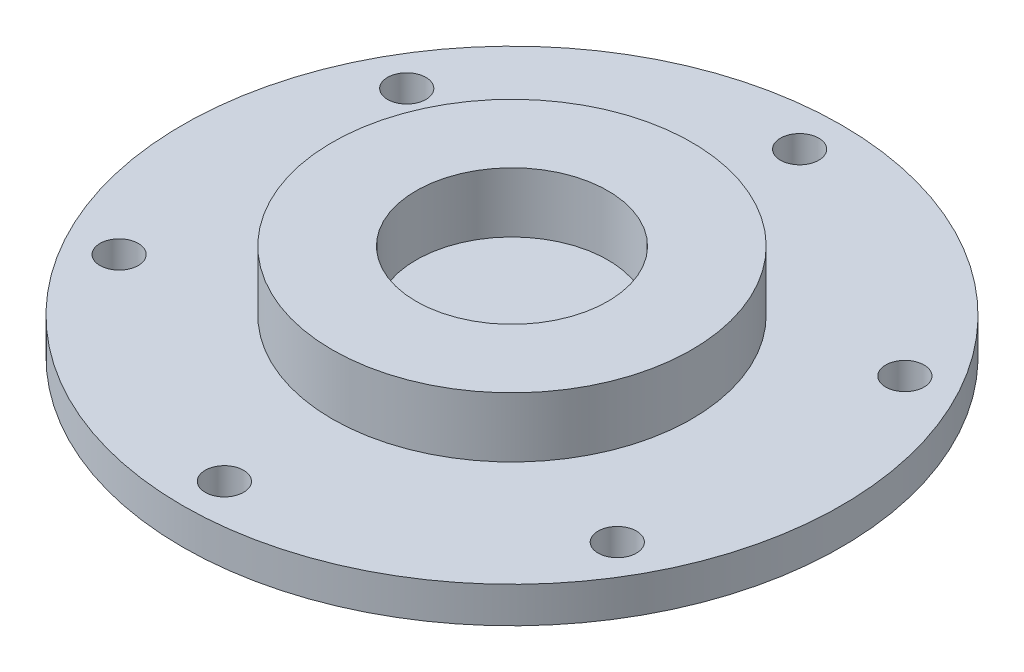
ISO-10303-21;
HEADER;
FILE_DESCRIPTION(('STEP AP214'),'2;1');
FILE_NAME('part.step','',(''),(''),'','','');
FILE_SCHEMA(('AUTOMOTIVE_DESIGN { 1 0 10303 214 1 1 1 1 }'));
ENDSEC;
DATA;
#1=APPLICATION_CONTEXT('core data for automotive mechanical design processes');
#2=APPLICATION_PROTOCOL_DEFINITION('international standard','automotive_design',2000,#1);
#3=PRODUCT_CONTEXT('',#1,'mechanical');
#4=PRODUCT('Part','Part','',(#3));
#5=PRODUCT_RELATED_PRODUCT_CATEGORY('part','',(#4));
#6=PRODUCT_DEFINITION_FORMATION('','',#4);
#7=PRODUCT_DEFINITION_CONTEXT('part definition',#1,'design');
#8=PRODUCT_DEFINITION('design','',#6,#7);
#9=PRODUCT_DEFINITION_SHAPE('','',#8);
#10=(LENGTH_UNIT() NAMED_UNIT(*) SI_UNIT(.MILLI.,.METRE.));
#11=(NAMED_UNIT(*) PLANE_ANGLE_UNIT() SI_UNIT($,.RADIAN.));
#12=(NAMED_UNIT(*) SI_UNIT($,.STERADIAN.) SOLID_ANGLE_UNIT());
#13=UNCERTAINTY_MEASURE_WITH_UNIT(LENGTH_MEASURE(1.E-05),#10,'distance_accuracy_value','');
#14=(GEOMETRIC_REPRESENTATION_CONTEXT(3) GLOBAL_UNCERTAINTY_ASSIGNED_CONTEXT((#13)) GLOBAL_UNIT_ASSIGNED_CONTEXT((#10,
#11,#12)) REPRESENTATION_CONTEXT('',''));
#15=CARTESIAN_POINT('',(0.,0.,0.));
#16=DIRECTION('',(0.,0.,1.));
#17=DIRECTION('',(1.,0.,0.));
#18=AXIS2_PLACEMENT_3D('',#15,#16,#17);
#19=CARTESIAN_POINT('',(0.,3.,0.));
#20=DIRECTION('',(0.,-1.,0.));
#21=DIRECTION('',(0.,0.,-1.));
#22=AXIS2_PLACEMENT_3D('',#19,#20,#21);
#23=CYLINDRICAL_SURFACE('',#22,27.5);
#24=CARTESIAN_POINT('',(0.,3.,0.));
#25=DIRECTION('',(0.,1.,0.));
#26=DIRECTION('',(0.,0.,1.));
#27=AXIS2_PLACEMENT_3D('',#24,#25,#26);
#28=CIRCLE('',#27,27.5);
#29=CARTESIAN_POINT('',(0.,3.,27.5));
#30=VERTEX_POINT('',#29);
#31=EDGE_CURVE('E10',#30,#30,#28,.T.);
#32=ORIENTED_EDGE('',*,*,#31,.F.);
#33=EDGE_LOOP('',(#32));
#34=FACE_BOUND('',#33,.T.);
#35=CARTESIAN_POINT('',(0.,0.,0.));
#36=DIRECTION('',(0.,1.,0.));
#37=DIRECTION('',(0.,0.,1.));
#38=AXIS2_PLACEMENT_3D('',#35,#36,#37);
#39=CIRCLE('',#38,27.5);
#40=CARTESIAN_POINT('',(0.,0.,27.5));
#41=VERTEX_POINT('',#40);
#42=EDGE_CURVE('E37',#41,#41,#39,.T.);
#43=ORIENTED_EDGE('',*,*,#42,.T.);
#44=EDGE_LOOP('',(#43));
#45=FACE_BOUND('',#44,.T.);
#46=ADVANCED_FACE('F34',(#34,#45),#23,.T.);
#47=CARTESIAN_POINT('',(0.,3.,0.));
#48=DIRECTION('',(0.,1.,0.));
#49=DIRECTION('',(0.,0.,1.));
#50=AXIS2_PLACEMENT_3D('',#47,#48,#49);
#51=PLANE('',#50);
#52=CARTESIAN_POINT('',(-20.7846096908265,3.,12.0000000000001));
#53=DIRECTION('',(0.,1.,0.));
#54=DIRECTION('',(0.866025403784436,0.,-0.500000000000004));
#55=AXIS2_PLACEMENT_3D('',#52,#53,#54);
#56=CIRCLE('',#55,1.6);
#57=CARTESIAN_POINT('',(-20.7846096908265,3.,13.6000000000001));
#58=VERTEX_POINT('',#57);
#59=EDGE_CURVE('E81',#58,#58,#56,.T.);
#60=ORIENTED_EDGE('',*,*,#59,.F.);
#61=EDGE_LOOP('',(#60));
#62=FACE_BOUND('',#61,.T.);
#63=CARTESIAN_POINT('',(0.,3.,24.));
#64=DIRECTION('',(0.,1.,0.));
#65=DIRECTION('',(0.,0.,-1.));
#66=AXIS2_PLACEMENT_3D('',#63,#64,#65);
#67=CIRCLE('',#66,1.6);
#68=CARTESIAN_POINT('',(0.,3.,25.6));
#69=VERTEX_POINT('',#68);
#70=EDGE_CURVE('E75',#69,#69,#67,.T.);
#71=ORIENTED_EDGE('',*,*,#70,.F.);
#72=EDGE_LOOP('',(#71));
#73=FACE_BOUND('',#72,.T.);
#74=CARTESIAN_POINT('',(20.7846096908266,3.,11.9999999999998));
#75=DIRECTION('',(0.,1.,0.));
#76=DIRECTION('',(-0.866025403784443,0.,-0.499999999999992));
#77=AXIS2_PLACEMENT_3D('',#74,#75,#76);
#78=CIRCLE('',#77,1.6);
#79=CARTESIAN_POINT('',(20.7846096908266,3.,13.5999999999998));
#80=VERTEX_POINT('',#79);
#81=EDGE_CURVE('E67',#80,#80,#78,.T.);
#82=ORIENTED_EDGE('',*,*,#81,.F.);
#83=EDGE_LOOP('',(#82));
#84=FACE_BOUND('',#83,.T.);
#85=CARTESIAN_POINT('',(20.7846096908264,3.,-12.0000000000002));
#86=DIRECTION('',(0.,1.,0.));
#87=DIRECTION('',(-0.866025403784433,0.,0.50000000000001));
#88=AXIS2_PLACEMENT_3D('',#85,#86,#87);
#89=CIRCLE('',#88,1.6);
#90=CARTESIAN_POINT('',(20.7846096908264,3.,-10.4000000000002));
#91=VERTEX_POINT('',#90);
#92=EDGE_CURVE('E68',#91,#91,#89,.T.);
#93=ORIENTED_EDGE('',*,*,#92,.F.);
#94=EDGE_LOOP('',(#93));
#95=FACE_BOUND('',#94,.T.);
#96=CARTESIAN_POINT('',(-20.7846096908266,3.,-12.));
#97=DIRECTION('',(0.,1.,0.));
#98=DIRECTION('',(0.86602540378444,0.,0.499999999999998));
#99=AXIS2_PLACEMENT_3D('',#96,#97,#98);
#100=CIRCLE('',#99,1.6);
#101=CARTESIAN_POINT('',(-20.7846096908266,3.,-10.4));
#102=VERTEX_POINT('',#101);
#103=EDGE_CURVE('E60',#102,#102,#100,.T.);
#104=ORIENTED_EDGE('',*,*,#103,.F.);
#105=EDGE_LOOP('',(#104));
#106=FACE_BOUND('',#105,.T.);
#107=CARTESIAN_POINT('',(0.,3.,-24.));
#108=DIRECTION('',(0.,1.,0.));
#109=DIRECTION('',(0.,0.,1.));
#110=AXIS2_PLACEMENT_3D('',#107,#108,#109);
#111=CIRCLE('',#110,1.6);
#112=CARTESIAN_POINT('',(0.,3.,-22.4));
#113=VERTEX_POINT('',#112);
#114=EDGE_CURVE('E54',#113,#113,#111,.T.);
#115=ORIENTED_EDGE('',*,*,#114,.F.);
#116=EDGE_LOOP('',(#115));
#117=FACE_BOUND('',#116,.T.);
#118=CARTESIAN_POINT('',(0.,3.,0.));
#119=DIRECTION('',(0.,1.,0.));
#120=DIRECTION('',(0.,0.,1.));
#121=AXIS2_PLACEMENT_3D('',#118,#119,#120);
#122=CIRCLE('',#121,15.);
#123=CARTESIAN_POINT('',(0.,3.,15.));
#124=VERTEX_POINT('',#123);
#125=EDGE_CURVE('E46',#124,#124,#122,.T.);
#126=ORIENTED_EDGE('',*,*,#125,.F.);
#127=EDGE_LOOP('',(#126));
#128=FACE_BOUND('',#127,.T.);
#129=ORIENTED_EDGE('',*,*,#31,.T.);
#130=EDGE_LOOP('',(#129));
#131=FACE_BOUND('',#130,.T.);
#132=ADVANCED_FACE('F117',(#62,#73,#84,#95,#106,#117,#128,#131),#51,.T.);
#133=CARTESIAN_POINT('',(0.,0.,0.));
#134=DIRECTION('',(0.,1.,0.));
#135=DIRECTION('',(0.,0.,1.));
#136=AXIS2_PLACEMENT_3D('',#133,#134,#135);
#137=PLANE('',#136);
#138=CARTESIAN_POINT('',(-20.7846096908265,0.,12.0000000000001));
#139=DIRECTION('',(0.,1.,0.));
#140=DIRECTION('',(0.,0.,1.));
#141=AXIS2_PLACEMENT_3D('',#138,#139,#140);
#142=CIRCLE('',#141,1.6);
#143=CARTESIAN_POINT('',(-20.7846096908265,0.,13.6000000000001));
#144=VERTEX_POINT('',#143);
#145=EDGE_CURVE('E63',#144,#144,#142,.F.);
#146=ORIENTED_EDGE('',*,*,#145,.F.);
#147=EDGE_LOOP('',(#146));
#148=FACE_BOUND('',#147,.T.);
#149=CARTESIAN_POINT('',(0.,0.,24.));
#150=DIRECTION('',(0.,1.,0.));
#151=DIRECTION('',(0.,0.,1.));
#152=AXIS2_PLACEMENT_3D('',#149,#150,#151);
#153=CIRCLE('',#152,1.6);
#154=CARTESIAN_POINT('',(0.,0.,25.6));
#155=VERTEX_POINT('',#154);
#156=EDGE_CURVE('E78',#155,#155,#153,.F.);
#157=ORIENTED_EDGE('',*,*,#156,.F.);
#158=EDGE_LOOP('',(#157));
#159=FACE_BOUND('',#158,.T.);
#160=CARTESIAN_POINT('',(20.7846096908266,0.,11.9999999999998));
#161=DIRECTION('',(0.,1.,0.));
#162=DIRECTION('',(0.,0.,1.));
#163=AXIS2_PLACEMENT_3D('',#160,#161,#162);
#164=CIRCLE('',#163,1.6);
#165=CARTESIAN_POINT('',(20.7846096908266,0.,13.5999999999998));
#166=VERTEX_POINT('',#165);
#167=EDGE_CURVE('E72',#166,#166,#164,.F.);
#168=ORIENTED_EDGE('',*,*,#167,.F.);
#169=EDGE_LOOP('',(#168));
#170=FACE_BOUND('',#169,.T.);
#171=CARTESIAN_POINT('',(20.7846096908264,0.,-12.0000000000002));
#172=DIRECTION('',(0.,1.,0.));
#173=DIRECTION('',(0.,0.,1.));
#174=AXIS2_PLACEMENT_3D('',#171,#172,#173);
#175=CIRCLE('',#174,1.6);
#176=CARTESIAN_POINT('',(20.7846096908264,0.,-10.4000000000002));
#177=VERTEX_POINT('',#176);
#178=EDGE_CURVE('E64',#177,#177,#175,.F.);
#179=ORIENTED_EDGE('',*,*,#178,.F.);
#180=EDGE_LOOP('',(#179));
#181=FACE_BOUND('',#180,.T.);
#182=CARTESIAN_POINT('',(-20.7846096908266,0.,-12.));
#183=DIRECTION('',(0.,1.,0.));
#184=DIRECTION('',(0.,0.,1.));
#185=AXIS2_PLACEMENT_3D('',#182,#183,#184);
#186=CIRCLE('',#185,1.6);
#187=CARTESIAN_POINT('',(-20.7846096908266,0.,-10.4));
#188=VERTEX_POINT('',#187);
#189=EDGE_CURVE('E57',#188,#188,#186,.F.);
#190=ORIENTED_EDGE('',*,*,#189,.F.);
#191=EDGE_LOOP('',(#190));
#192=FACE_BOUND('',#191,.T.);
#193=CARTESIAN_POINT('',(0.,0.,-24.));
#194=DIRECTION('',(0.,1.,0.));
#195=DIRECTION('',(0.,0.,1.));
#196=AXIS2_PLACEMENT_3D('',#193,#194,#195);
#197=CIRCLE('',#196,1.6);
#198=CARTESIAN_POINT('',(0.,0.,-22.4));
#199=VERTEX_POINT('',#198);
#200=EDGE_CURVE('E49',#199,#199,#197,.F.);
#201=ORIENTED_EDGE('',*,*,#200,.F.);
#202=EDGE_LOOP('',(#201));
#203=FACE_BOUND('',#202,.T.);
#204=ORIENTED_EDGE('',*,*,#42,.F.);
#205=EDGE_LOOP('',(#204));
#206=FACE_BOUND('',#205,.T.);
#207=ADVANCED_FACE('F113',(#148,#159,#170,#181,#192,#203,#206),#137,.F.);
#208=CARTESIAN_POINT('',(0.,8.,0.));
#209=DIRECTION('',(0.,-1.,0.));
#210=DIRECTION('',(0.,0.,-1.));
#211=AXIS2_PLACEMENT_3D('',#208,#209,#210);
#212=CYLINDRICAL_SURFACE('',#211,15.);
#213=CARTESIAN_POINT('',(0.,8.,0.));
#214=DIRECTION('',(0.,1.,0.));
#215=DIRECTION('',(0.,0.,1.));
#216=AXIS2_PLACEMENT_3D('',#213,#214,#215);
#217=CIRCLE('',#216,15.);
#218=CARTESIAN_POINT('',(0.,8.,15.));
#219=VERTEX_POINT('',#218);
#220=EDGE_CURVE('E44',#219,#219,#217,.T.);
#221=ORIENTED_EDGE('',*,*,#220,.F.);
#222=EDGE_LOOP('',(#221));
#223=FACE_BOUND('',#222,.T.);
#224=ORIENTED_EDGE('',*,*,#125,.T.);
#225=EDGE_LOOP('',(#224));
#226=FACE_BOUND('',#225,.T.);
#227=ADVANCED_FACE('F107',(#223,#226),#212,.T.);
#228=CARTESIAN_POINT('',(0.,8.,0.));
#229=DIRECTION('',(0.,1.,0.));
#230=DIRECTION('',(0.,0.,1.));
#231=AXIS2_PLACEMENT_3D('',#228,#229,#230);
#232=PLANE('',#231);
#233=CARTESIAN_POINT('',(0.,8.,0.));
#234=DIRECTION('',(0.,1.,0.));
#235=DIRECTION('',(0.,0.,1.));
#236=AXIS2_PLACEMENT_3D('',#233,#234,#235);
#237=CIRCLE('',#236,8.);
#238=CARTESIAN_POINT('',(0.,8.,8.));
#239=VERTEX_POINT('',#238);
#240=EDGE_CURVE('E88',#239,#239,#237,.T.);
#241=ORIENTED_EDGE('',*,*,#240,.F.);
#242=EDGE_LOOP('',(#241));
#243=FACE_BOUND('',#242,.T.);
#244=ORIENTED_EDGE('',*,*,#220,.T.);
#245=EDGE_LOOP('',(#244));
#246=FACE_BOUND('',#245,.T.);
#247=ADVANCED_FACE('F103',(#243,#246),#232,.T.);
#248=CARTESIAN_POINT('',(0.,-0.00100000000000013,-24.));
#249=DIRECTION('',(0.,1.,0.));
#250=DIRECTION('',(0.,0.,1.));
#251=AXIS2_PLACEMENT_3D('',#248,#249,#250);
#252=CYLINDRICAL_SURFACE('',#251,1.6);
#253=CARTESIAN_POINT('',(0.,3.,-22.4));
#254=CARTESIAN_POINT('',(0.,2.96875,-22.4));
#255=CARTESIAN_POINT('',(0.,2.9375,-22.4));
#256=CARTESIAN_POINT('',(0.,2.875,-22.4));
#257=CARTESIAN_POINT('',(0.,2.84375,-22.4));
#258=CARTESIAN_POINT('',(0.,2.78125,-22.4));
#259=CARTESIAN_POINT('',(0.,2.75,-22.4));
#260=CARTESIAN_POINT('',(0.,2.6875,-22.4));
#261=CARTESIAN_POINT('',(0.,2.65625,-22.4));
#262=CARTESIAN_POINT('',(0.,2.59375,-22.4));
#263=CARTESIAN_POINT('',(0.,2.5625,-22.4));
#264=CARTESIAN_POINT('',(0.,2.5,-22.4));
#265=CARTESIAN_POINT('',(0.,2.46875,-22.4));
#266=CARTESIAN_POINT('',(0.,2.40625,-22.4));
#267=CARTESIAN_POINT('',(0.,2.375,-22.4));
#268=CARTESIAN_POINT('',(0.,2.3125,-22.4));
#269=CARTESIAN_POINT('',(0.,2.28125,-22.4));
#270=CARTESIAN_POINT('',(0.,2.21875,-22.4));
#271=CARTESIAN_POINT('',(0.,2.1875,-22.4));
#272=CARTESIAN_POINT('',(0.,2.125,-22.4));
#273=CARTESIAN_POINT('',(0.,2.09375,-22.4));
#274=CARTESIAN_POINT('',(0.,2.03125,-22.4));
#275=CARTESIAN_POINT('',(0.,2.,-22.4));
#276=CARTESIAN_POINT('',(0.,1.9375,-22.4));
#277=CARTESIAN_POINT('',(0.,1.90625,-22.4));
#278=CARTESIAN_POINT('',(0.,1.84375,-22.4));
#279=CARTESIAN_POINT('',(0.,1.8125,-22.4));
#280=CARTESIAN_POINT('',(0.,1.75,-22.4));
#281=CARTESIAN_POINT('',(0.,1.71875,-22.4));
#282=CARTESIAN_POINT('',(0.,1.65625,-22.4));
#283=CARTESIAN_POINT('',(0.,1.625,-22.4));
#284=CARTESIAN_POINT('',(0.,1.5625,-22.4));
#285=CARTESIAN_POINT('',(0.,1.53125,-22.4));
#286=CARTESIAN_POINT('',(0.,1.46875,-22.4));
#287=CARTESIAN_POINT('',(0.,1.4375,-22.4));
#288=CARTESIAN_POINT('',(0.,1.375,-22.4));
#289=CARTESIAN_POINT('',(0.,1.34375,-22.4));
#290=CARTESIAN_POINT('',(0.,1.28125,-22.4));
#291=CARTESIAN_POINT('',(0.,1.25,-22.4));
#292=CARTESIAN_POINT('',(0.,1.1875,-22.4));
#293=CARTESIAN_POINT('',(0.,1.15625,-22.4));
#294=CARTESIAN_POINT('',(0.,1.09375,-22.4));
#295=CARTESIAN_POINT('',(0.,1.0625,-22.4));
#296=CARTESIAN_POINT('',(0.,1.,-22.4));
#297=CARTESIAN_POINT('',(0.,0.96875,-22.4));
#298=CARTESIAN_POINT('',(0.,0.90625,-22.4));
#299=CARTESIAN_POINT('',(0.,0.875,-22.4));
#300=CARTESIAN_POINT('',(0.,0.8125,-22.4));
#301=CARTESIAN_POINT('',(0.,0.78125,-22.4));
#302=CARTESIAN_POINT('',(0.,0.71875,-22.4));
#303=CARTESIAN_POINT('',(0.,0.6875,-22.4));
#304=CARTESIAN_POINT('',(0.,0.625,-22.4));
#305=CARTESIAN_POINT('',(0.,0.59375,-22.4));
#306=CARTESIAN_POINT('',(0.,0.53125,-22.4));
#307=CARTESIAN_POINT('',(0.,0.5,-22.4));
#308=CARTESIAN_POINT('',(0.,0.4375,-22.4));
#309=CARTESIAN_POINT('',(0.,0.40625,-22.4));
#310=CARTESIAN_POINT('',(0.,0.34375,-22.4));
#311=CARTESIAN_POINT('',(0.,0.3125,-22.4));
#312=CARTESIAN_POINT('',(0.,0.25,-22.4));
#313=CARTESIAN_POINT('',(0.,0.21875,-22.4));
#314=CARTESIAN_POINT('',(0.,0.15625,-22.4));
#315=CARTESIAN_POINT('',(0.,0.125,-22.4));
#316=CARTESIAN_POINT('',(0.,0.0625000000000001,-22.4));
#317=CARTESIAN_POINT('',(0.,0.0312500000000001,-22.4));
#318=CARTESIAN_POINT('',(0.,0.,-22.4));
#319=B_SPLINE_CURVE_WITH_KNOTS('',3,(#253,#254,#255,#256,#257,#258,#259,#260,#261,#262,#263,
#264,#265,#266,#267,#268,#269,#270,#271,#272,#273,#274,#275,#276,#277,#278,#279,#280,#281,#282,
#283,#284,#285,#286,#287,#288,#289,#290,#291,#292,#293,#294,#295,#296,#297,#298,#299,#300,#301,
#302,#303,#304,#305,#306,#307,#308,#309,#310,#311,#312,#313,#314,#315,#316,#317,#318),
.UNSPECIFIED.,.F.,.F.,(4,2,2,2,2,2,2,2,2,2,2,2,2,2,2,2,2,2,2,2,2,2,2,2,2,2,2,2,2,2,2,2,4),(0.,
0.0937500000000001,0.1875,0.28125,0.375,0.46875,0.5625,0.65625,0.75,0.84375,0.9375,1.03125,
1.125,1.21875,1.3125,1.40625,1.5,1.59375,1.6875,1.78125,1.875,1.96875,2.0625,2.15625,2.25,
2.34375,2.4375,2.53125,2.625,2.71875,2.8125,2.90625,3.),.UNSPECIFIED.);
#320=EDGE_CURVE('BSEAM106',#113,#199,#319,.T.);
#321=ORIENTED_EDGE('',*,*,#114,.T.);
#322=ORIENTED_EDGE('',*,*,#200,.T.);
#323=ORIENTED_EDGE('',*,*,#320,.T.);
#324=ORIENTED_EDGE('',*,*,#320,.F.);
#325=EDGE_LOOP('',(#321,#323,#322,#324));
#326=FACE_BOUND('',#325,.T.);
#327=ADVANCED_FACE('F106',(#326),#252,.F.);
#328=CARTESIAN_POINT('',(-20.7846096908266,-0.00100000000000013,-12.));
#329=DIRECTION('',(0.,1.,0.));
#330=DIRECTION('',(0.,0.,1.));
#331=AXIS2_PLACEMENT_3D('',#328,#329,#330);
#332=CYLINDRICAL_SURFACE('',#331,1.6);
#333=CARTESIAN_POINT('',(-20.7846096908266,3.,-10.4));
#334=CARTESIAN_POINT('',(-20.7846096908266,2.96875,-10.4));
#335=CARTESIAN_POINT('',(-20.7846096908266,2.9375,-10.4));
#336=CARTESIAN_POINT('',(-20.7846096908266,2.875,-10.4));
#337=CARTESIAN_POINT('',(-20.7846096908266,2.84375,-10.4));
#338=CARTESIAN_POINT('',(-20.7846096908266,2.78125,-10.4));
#339=CARTESIAN_POINT('',(-20.7846096908266,2.75,-10.4));
#340=CARTESIAN_POINT('',(-20.7846096908266,2.6875,-10.4));
#341=CARTESIAN_POINT('',(-20.7846096908266,2.65625,-10.4));
#342=CARTESIAN_POINT('',(-20.7846096908266,2.59375,-10.4));
#343=CARTESIAN_POINT('',(-20.7846096908266,2.5625,-10.4));
#344=CARTESIAN_POINT('',(-20.7846096908266,2.5,-10.4));
#345=CARTESIAN_POINT('',(-20.7846096908266,2.46875,-10.4));
#346=CARTESIAN_POINT('',(-20.7846096908266,2.40625,-10.4));
#347=CARTESIAN_POINT('',(-20.7846096908266,2.375,-10.4));
#348=CARTESIAN_POINT('',(-20.7846096908266,2.3125,-10.4));
#349=CARTESIAN_POINT('',(-20.7846096908266,2.28125,-10.4));
#350=CARTESIAN_POINT('',(-20.7846096908266,2.21875,-10.4));
#351=CARTESIAN_POINT('',(-20.7846096908266,2.1875,-10.4));
#352=CARTESIAN_POINT('',(-20.7846096908266,2.125,-10.4));
#353=CARTESIAN_POINT('',(-20.7846096908266,2.09375,-10.4));
#354=CARTESIAN_POINT('',(-20.7846096908266,2.03125,-10.4));
#355=CARTESIAN_POINT('',(-20.7846096908266,2.,-10.4));
#356=CARTESIAN_POINT('',(-20.7846096908266,1.9375,-10.4));
#357=CARTESIAN_POINT('',(-20.7846096908266,1.90625,-10.4));
#358=CARTESIAN_POINT('',(-20.7846096908266,1.84375,-10.4));
#359=CARTESIAN_POINT('',(-20.7846096908266,1.8125,-10.4));
#360=CARTESIAN_POINT('',(-20.7846096908266,1.75,-10.4));
#361=CARTESIAN_POINT('',(-20.7846096908266,1.71875,-10.4));
#362=CARTESIAN_POINT('',(-20.7846096908266,1.65625,-10.4));
#363=CARTESIAN_POINT('',(-20.7846096908266,1.625,-10.4));
#364=CARTESIAN_POINT('',(-20.7846096908266,1.5625,-10.4));
#365=CARTESIAN_POINT('',(-20.7846096908266,1.53125,-10.4));
#366=CARTESIAN_POINT('',(-20.7846096908266,1.46875,-10.4));
#367=CARTESIAN_POINT('',(-20.7846096908266,1.4375,-10.4));
#368=CARTESIAN_POINT('',(-20.7846096908266,1.375,-10.4));
#369=CARTESIAN_POINT('',(-20.7846096908266,1.34375,-10.4));
#370=CARTESIAN_POINT('',(-20.7846096908266,1.28125,-10.4));
#371=CARTESIAN_POINT('',(-20.7846096908266,1.25,-10.4));
#372=CARTESIAN_POINT('',(-20.7846096908266,1.1875,-10.4));
#373=CARTESIAN_POINT('',(-20.7846096908266,1.15625,-10.4));
#374=CARTESIAN_POINT('',(-20.7846096908266,1.09375,-10.4));
#375=CARTESIAN_POINT('',(-20.7846096908266,1.0625,-10.4));
#376=CARTESIAN_POINT('',(-20.7846096908266,1.,-10.4));
#377=CARTESIAN_POINT('',(-20.7846096908266,0.96875,-10.4));
#378=CARTESIAN_POINT('',(-20.7846096908266,0.90625,-10.4));
#379=CARTESIAN_POINT('',(-20.7846096908266,0.875,-10.4));
#380=CARTESIAN_POINT('',(-20.7846096908266,0.8125,-10.4));
#381=CARTESIAN_POINT('',(-20.7846096908266,0.78125,-10.4));
#382=CARTESIAN_POINT('',(-20.7846096908266,0.71875,-10.4));
#383=CARTESIAN_POINT('',(-20.7846096908266,0.6875,-10.4));
#384=CARTESIAN_POINT('',(-20.7846096908266,0.625,-10.4));
#385=CARTESIAN_POINT('',(-20.7846096908266,0.59375,-10.4));
#386=CARTESIAN_POINT('',(-20.7846096908266,0.53125,-10.4));
#387=CARTESIAN_POINT('',(-20.7846096908266,0.5,-10.4));
#388=CARTESIAN_POINT('',(-20.7846096908266,0.4375,-10.4));
#389=CARTESIAN_POINT('',(-20.7846096908266,0.40625,-10.4));
#390=CARTESIAN_POINT('',(-20.7846096908266,0.34375,-10.4));
#391=CARTESIAN_POINT('',(-20.7846096908266,0.3125,-10.4));
#392=CARTESIAN_POINT('',(-20.7846096908266,0.25,-10.4));
#393=CARTESIAN_POINT('',(-20.7846096908266,0.21875,-10.4));
#394=CARTESIAN_POINT('',(-20.7846096908266,0.15625,-10.4));
#395=CARTESIAN_POINT('',(-20.7846096908266,0.125,-10.4));
#396=CARTESIAN_POINT('',(-20.7846096908266,0.0625000000000001,-10.4));
#397=CARTESIAN_POINT('',(-20.7846096908266,0.0312500000000001,-10.4));
#398=CARTESIAN_POINT('',(-20.7846096908266,0.,-10.4));
#399=B_SPLINE_CURVE_WITH_KNOTS('',3,(#333,#334,#335,#336,#337,#338,#339,#340,#341,#342,#343,
#344,#345,#346,#347,#348,#349,#350,#351,#352,#353,#354,#355,#356,#357,#358,#359,#360,#361,#362,
#363,#364,#365,#366,#367,#368,#369,#370,#371,#372,#373,#374,#375,#376,#377,#378,#379,#380,#381,
#382,#383,#384,#385,#386,#387,#388,#389,#390,#391,#392,#393,#394,#395,#396,#397,#398),
.UNSPECIFIED.,.F.,.F.,(4,2,2,2,2,2,2,2,2,2,2,2,2,2,2,2,2,2,2,2,2,2,2,2,2,2,2,2,2,2,2,2,4),(0.,
0.0937500000000001,0.1875,0.28125,0.375,0.46875,0.5625,0.65625,0.75,0.84375,0.9375,1.03125,
1.125,1.21875,1.3125,1.40625,1.5,1.59375,1.6875,1.78125,1.875,1.96875,2.0625,2.15625,2.25,
2.34375,2.4375,2.53125,2.625,2.71875,2.8125,2.90625,3.),.UNSPECIFIED.);
#400=EDGE_CURVE('BSEAM132',#102,#188,#399,.T.);
#401=ORIENTED_EDGE('',*,*,#103,.T.);
#402=ORIENTED_EDGE('',*,*,#189,.T.);
#403=ORIENTED_EDGE('',*,*,#400,.T.);
#404=ORIENTED_EDGE('',*,*,#400,.F.);
#405=EDGE_LOOP('',(#401,#403,#402,#404));
#406=FACE_BOUND('',#405,.T.);
#407=ADVANCED_FACE('F132',(#406),#332,.F.);
#408=CARTESIAN_POINT('',(20.7846096908264,-0.00100000000000013,-12.0000000000002));
#409=DIRECTION('',(0.,1.,0.));
#410=DIRECTION('',(0.,0.,1.));
#411=AXIS2_PLACEMENT_3D('',#408,#409,#410);
#412=CYLINDRICAL_SURFACE('',#411,1.6);
#413=CARTESIAN_POINT('',(20.7846096908264,3.,-10.4000000000002));
#414=CARTESIAN_POINT('',(20.7846096908264,2.96875,-10.4000000000002));
#415=CARTESIAN_POINT('',(20.7846096908264,2.9375,-10.4000000000002));
#416=CARTESIAN_POINT('',(20.7846096908264,2.875,-10.4000000000002));
#417=CARTESIAN_POINT('',(20.7846096908264,2.84375,-10.4000000000002));
#418=CARTESIAN_POINT('',(20.7846096908264,2.78125,-10.4000000000002));
#419=CARTESIAN_POINT('',(20.7846096908264,2.75,-10.4000000000002));
#420=CARTESIAN_POINT('',(20.7846096908264,2.6875,-10.4000000000002));
#421=CARTESIAN_POINT('',(20.7846096908264,2.65625,-10.4000000000002));
#422=CARTESIAN_POINT('',(20.7846096908264,2.59375,-10.4000000000002));
#423=CARTESIAN_POINT('',(20.7846096908264,2.5625,-10.4000000000002));
#424=CARTESIAN_POINT('',(20.7846096908264,2.5,-10.4000000000002));
#425=CARTESIAN_POINT('',(20.7846096908264,2.46875,-10.4000000000002));
#426=CARTESIAN_POINT('',(20.7846096908264,2.40625,-10.4000000000002));
#427=CARTESIAN_POINT('',(20.7846096908264,2.375,-10.4000000000002));
#428=CARTESIAN_POINT('',(20.7846096908264,2.3125,-10.4000000000002));
#429=CARTESIAN_POINT('',(20.7846096908264,2.28125,-10.4000000000002));
#430=CARTESIAN_POINT('',(20.7846096908264,2.21875,-10.4000000000002));
#431=CARTESIAN_POINT('',(20.7846096908264,2.1875,-10.4000000000002));
#432=CARTESIAN_POINT('',(20.7846096908264,2.125,-10.4000000000002));
#433=CARTESIAN_POINT('',(20.7846096908264,2.09375,-10.4000000000002));
#434=CARTESIAN_POINT('',(20.7846096908264,2.03125,-10.4000000000002));
#435=CARTESIAN_POINT('',(20.7846096908264,2.,-10.4000000000002));
#436=CARTESIAN_POINT('',(20.7846096908264,1.9375,-10.4000000000002));
#437=CARTESIAN_POINT('',(20.7846096908264,1.90625,-10.4000000000002));
#438=CARTESIAN_POINT('',(20.7846096908264,1.84375,-10.4000000000002));
#439=CARTESIAN_POINT('',(20.7846096908264,1.8125,-10.4000000000002));
#440=CARTESIAN_POINT('',(20.7846096908264,1.75,-10.4000000000002));
#441=CARTESIAN_POINT('',(20.7846096908264,1.71875,-10.4000000000002));
#442=CARTESIAN_POINT('',(20.7846096908264,1.65625,-10.4000000000002));
#443=CARTESIAN_POINT('',(20.7846096908264,1.625,-10.4000000000002));
#444=CARTESIAN_POINT('',(20.7846096908264,1.5625,-10.4000000000002));
#445=CARTESIAN_POINT('',(20.7846096908264,1.53125,-10.4000000000002));
#446=CARTESIAN_POINT('',(20.7846096908264,1.46875,-10.4000000000002));
#447=CARTESIAN_POINT('',(20.7846096908264,1.4375,-10.4000000000002));
#448=CARTESIAN_POINT('',(20.7846096908264,1.375,-10.4000000000002));
#449=CARTESIAN_POINT('',(20.7846096908264,1.34375,-10.4000000000002));
#450=CARTESIAN_POINT('',(20.7846096908264,1.28125,-10.4000000000002));
#451=CARTESIAN_POINT('',(20.7846096908264,1.25,-10.4000000000002));
#452=CARTESIAN_POINT('',(20.7846096908264,1.1875,-10.4000000000002));
#453=CARTESIAN_POINT('',(20.7846096908264,1.15625,-10.4000000000002));
#454=CARTESIAN_POINT('',(20.7846096908264,1.09375,-10.4000000000002));
#455=CARTESIAN_POINT('',(20.7846096908264,1.0625,-10.4000000000002));
#456=CARTESIAN_POINT('',(20.7846096908264,1.,-10.4000000000002));
#457=CARTESIAN_POINT('',(20.7846096908264,0.96875,-10.4000000000002));
#458=CARTESIAN_POINT('',(20.7846096908264,0.90625,-10.4000000000002));
#459=CARTESIAN_POINT('',(20.7846096908264,0.875,-10.4000000000002));
#460=CARTESIAN_POINT('',(20.7846096908264,0.8125,-10.4000000000002));
#461=CARTESIAN_POINT('',(20.7846096908264,0.78125,-10.4000000000002));
#462=CARTESIAN_POINT('',(20.7846096908264,0.71875,-10.4000000000002));
#463=CARTESIAN_POINT('',(20.7846096908264,0.6875,-10.4000000000002));
#464=CARTESIAN_POINT('',(20.7846096908264,0.625,-10.4000000000002));
#465=CARTESIAN_POINT('',(20.7846096908264,0.59375,-10.4000000000002));
#466=CARTESIAN_POINT('',(20.7846096908264,0.53125,-10.4000000000002));
#467=CARTESIAN_POINT('',(20.7846096908264,0.5,-10.4000000000002));
#468=CARTESIAN_POINT('',(20.7846096908264,0.4375,-10.4000000000002));
#469=CARTESIAN_POINT('',(20.7846096908264,0.40625,-10.4000000000002));
#470=CARTESIAN_POINT('',(20.7846096908264,0.34375,-10.4000000000002));
#471=CARTESIAN_POINT('',(20.7846096908264,0.3125,-10.4000000000002));
#472=CARTESIAN_POINT('',(20.7846096908264,0.25,-10.4000000000002));
#473=CARTESIAN_POINT('',(20.7846096908264,0.21875,-10.4000000000002));
#474=CARTESIAN_POINT('',(20.7846096908264,0.15625,-10.4000000000002));
#475=CARTESIAN_POINT('',(20.7846096908264,0.125,-10.4000000000002));
#476=CARTESIAN_POINT('',(20.7846096908264,0.0625000000000001,-10.4000000000002));
#477=CARTESIAN_POINT('',(20.7846096908264,0.0312500000000001,-10.4000000000002));
#478=CARTESIAN_POINT('',(20.7846096908264,0.,-10.4000000000002));
#479=B_SPLINE_CURVE_WITH_KNOTS('',3,(#413,#414,#415,#416,#417,#418,#419,#420,#421,#422,#423,
#424,#425,#426,#427,#428,#429,#430,#431,#432,#433,#434,#435,#436,#437,#438,#439,#440,#441,#442,
#443,#444,#445,#446,#447,#448,#449,#450,#451,#452,#453,#454,#455,#456,#457,#458,#459,#460,#461,
#462,#463,#464,#465,#466,#467,#468,#469,#470,#471,#472,#473,#474,#475,#476,#477,#478),
.UNSPECIFIED.,.F.,.F.,(4,2,2,2,2,2,2,2,2,2,2,2,2,2,2,2,2,2,2,2,2,2,2,2,2,2,2,2,2,2,2,2,4),(0.,
0.0937500000000001,0.1875,0.28125,0.375,0.46875,0.5625,0.65625,0.75,0.84375,0.9375,1.03125,
1.125,1.21875,1.3125,1.40625,1.5,1.59375,1.6875,1.78125,1.875,1.96875,2.0625,2.15625,2.25,
2.34375,2.4375,2.53125,2.625,2.71875,2.8125,2.90625,3.),.UNSPECIFIED.);
#480=EDGE_CURVE('BSEAM136',#91,#177,#479,.T.);
#481=ORIENTED_EDGE('',*,*,#92,.T.);
#482=ORIENTED_EDGE('',*,*,#178,.T.);
#483=ORIENTED_EDGE('',*,*,#480,.T.);
#484=ORIENTED_EDGE('',*,*,#480,.F.);
#485=EDGE_LOOP('',(#481,#483,#482,#484));
#486=FACE_BOUND('',#485,.T.);
#487=ADVANCED_FACE('F136',(#486),#412,.F.);
#488=CARTESIAN_POINT('',(20.7846096908266,-0.00100000000000013,11.9999999999998));
#489=DIRECTION('',(0.,1.,0.));
#490=DIRECTION('',(0.,0.,1.));
#491=AXIS2_PLACEMENT_3D('',#488,#489,#490);
#492=CYLINDRICAL_SURFACE('',#491,1.6);
#493=CARTESIAN_POINT('',(20.7846096908266,3.,13.5999999999998));
#494=CARTESIAN_POINT('',(20.7846096908266,2.96875,13.5999999999998));
#495=CARTESIAN_POINT('',(20.7846096908266,2.9375,13.5999999999998));
#496=CARTESIAN_POINT('',(20.7846096908266,2.875,13.5999999999998));
#497=CARTESIAN_POINT('',(20.7846096908266,2.84375,13.5999999999998));
#498=CARTESIAN_POINT('',(20.7846096908266,2.78125,13.5999999999998));
#499=CARTESIAN_POINT('',(20.7846096908266,2.75,13.5999999999998));
#500=CARTESIAN_POINT('',(20.7846096908266,2.6875,13.5999999999998));
#501=CARTESIAN_POINT('',(20.7846096908266,2.65625,13.5999999999998));
#502=CARTESIAN_POINT('',(20.7846096908266,2.59375,13.5999999999998));
#503=CARTESIAN_POINT('',(20.7846096908266,2.5625,13.5999999999998));
#504=CARTESIAN_POINT('',(20.7846096908266,2.5,13.5999999999998));
#505=CARTESIAN_POINT('',(20.7846096908266,2.46875,13.5999999999998));
#506=CARTESIAN_POINT('',(20.7846096908266,2.40625,13.5999999999998));
#507=CARTESIAN_POINT('',(20.7846096908266,2.375,13.5999999999998));
#508=CARTESIAN_POINT('',(20.7846096908266,2.3125,13.5999999999998));
#509=CARTESIAN_POINT('',(20.7846096908266,2.28125,13.5999999999998));
#510=CARTESIAN_POINT('',(20.7846096908266,2.21875,13.5999999999998));
#511=CARTESIAN_POINT('',(20.7846096908266,2.1875,13.5999999999998));
#512=CARTESIAN_POINT('',(20.7846096908266,2.125,13.5999999999998));
#513=CARTESIAN_POINT('',(20.7846096908266,2.09375,13.5999999999998));
#514=CARTESIAN_POINT('',(20.7846096908266,2.03125,13.5999999999998));
#515=CARTESIAN_POINT('',(20.7846096908266,2.,13.5999999999998));
#516=CARTESIAN_POINT('',(20.7846096908266,1.9375,13.5999999999998));
#517=CARTESIAN_POINT('',(20.7846096908266,1.90625,13.5999999999998));
#518=CARTESIAN_POINT('',(20.7846096908266,1.84375,13.5999999999998));
#519=CARTESIAN_POINT('',(20.7846096908266,1.8125,13.5999999999998));
#520=CARTESIAN_POINT('',(20.7846096908266,1.75,13.5999999999998));
#521=CARTESIAN_POINT('',(20.7846096908266,1.71875,13.5999999999998));
#522=CARTESIAN_POINT('',(20.7846096908266,1.65625,13.5999999999998));
#523=CARTESIAN_POINT('',(20.7846096908266,1.625,13.5999999999998));
#524=CARTESIAN_POINT('',(20.7846096908266,1.5625,13.5999999999998));
#525=CARTESIAN_POINT('',(20.7846096908266,1.53125,13.5999999999998));
#526=CARTESIAN_POINT('',(20.7846096908266,1.46875,13.5999999999998));
#527=CARTESIAN_POINT('',(20.7846096908266,1.4375,13.5999999999998));
#528=CARTESIAN_POINT('',(20.7846096908266,1.375,13.5999999999998));
#529=CARTESIAN_POINT('',(20.7846096908266,1.34375,13.5999999999998));
#530=CARTESIAN_POINT('',(20.7846096908266,1.28125,13.5999999999998));
#531=CARTESIAN_POINT('',(20.7846096908266,1.25,13.5999999999998));
#532=CARTESIAN_POINT('',(20.7846096908266,1.1875,13.5999999999998));
#533=CARTESIAN_POINT('',(20.7846096908266,1.15625,13.5999999999998));
#534=CARTESIAN_POINT('',(20.7846096908266,1.09375,13.5999999999998));
#535=CARTESIAN_POINT('',(20.7846096908266,1.0625,13.5999999999998));
#536=CARTESIAN_POINT('',(20.7846096908266,1.,13.5999999999998));
#537=CARTESIAN_POINT('',(20.7846096908266,0.96875,13.5999999999998));
#538=CARTESIAN_POINT('',(20.7846096908266,0.90625,13.5999999999998));
#539=CARTESIAN_POINT('',(20.7846096908266,0.875,13.5999999999998));
#540=CARTESIAN_POINT('',(20.7846096908266,0.8125,13.5999999999998));
#541=CARTESIAN_POINT('',(20.7846096908266,0.78125,13.5999999999998));
#542=CARTESIAN_POINT('',(20.7846096908266,0.71875,13.5999999999998));
#543=CARTESIAN_POINT('',(20.7846096908266,0.6875,13.5999999999998));
#544=CARTESIAN_POINT('',(20.7846096908266,0.625,13.5999999999998));
#545=CARTESIAN_POINT('',(20.7846096908266,0.59375,13.5999999999998));
#546=CARTESIAN_POINT('',(20.7846096908266,0.53125,13.5999999999998));
#547=CARTESIAN_POINT('',(20.7846096908266,0.5,13.5999999999998));
#548=CARTESIAN_POINT('',(20.7846096908266,0.4375,13.5999999999998));
#549=CARTESIAN_POINT('',(20.7846096908266,0.40625,13.5999999999998));
#550=CARTESIAN_POINT('',(20.7846096908266,0.34375,13.5999999999998));
#551=CARTESIAN_POINT('',(20.7846096908266,0.3125,13.5999999999998));
#552=CARTESIAN_POINT('',(20.7846096908266,0.25,13.5999999999998));
#553=CARTESIAN_POINT('',(20.7846096908266,0.21875,13.5999999999998));
#554=CARTESIAN_POINT('',(20.7846096908266,0.15625,13.5999999999998));
#555=CARTESIAN_POINT('',(20.7846096908266,0.125,13.5999999999998));
#556=CARTESIAN_POINT('',(20.7846096908266,0.0625000000000001,13.5999999999998));
#557=CARTESIAN_POINT('',(20.7846096908266,0.0312500000000001,13.5999999999998));
#558=CARTESIAN_POINT('',(20.7846096908266,0.,13.5999999999998));
#559=B_SPLINE_CURVE_WITH_KNOTS('',3,(#493,#494,#495,#496,#497,#498,#499,#500,#501,#502,#503,
#504,#505,#506,#507,#508,#509,#510,#511,#512,#513,#514,#515,#516,#517,#518,#519,#520,#521,#522,
#523,#524,#525,#526,#527,#528,#529,#530,#531,#532,#533,#534,#535,#536,#537,#538,#539,#540,#541,
#542,#543,#544,#545,#546,#547,#548,#549,#550,#551,#552,#553,#554,#555,#556,#557,#558),
.UNSPECIFIED.,.F.,.F.,(4,2,2,2,2,2,2,2,2,2,2,2,2,2,2,2,2,2,2,2,2,2,2,2,2,2,2,2,2,2,2,2,4),(0.,
0.0937500000000001,0.1875,0.28125,0.375,0.46875,0.5625,0.65625,0.75,0.84375,0.9375,1.03125,
1.125,1.21875,1.3125,1.40625,1.5,1.59375,1.6875,1.78125,1.875,1.96875,2.0625,2.15625,2.25,
2.34375,2.4375,2.53125,2.625,2.71875,2.8125,2.90625,3.),.UNSPECIFIED.);
#560=EDGE_CURVE('BSEAM140',#80,#166,#559,.T.);
#561=ORIENTED_EDGE('',*,*,#81,.T.);
#562=ORIENTED_EDGE('',*,*,#167,.T.);
#563=ORIENTED_EDGE('',*,*,#560,.T.);
#564=ORIENTED_EDGE('',*,*,#560,.F.);
#565=EDGE_LOOP('',(#561,#563,#562,#564));
#566=FACE_BOUND('',#565,.T.);
#567=ADVANCED_FACE('F140',(#566),#492,.F.);
#568=CARTESIAN_POINT('',(0.,-0.00100000000000013,24.));
#569=DIRECTION('',(0.,1.,0.));
#570=DIRECTION('',(0.,0.,1.));
#571=AXIS2_PLACEMENT_3D('',#568,#569,#570);
#572=CYLINDRICAL_SURFACE('',#571,1.6);
#573=CARTESIAN_POINT('',(0.,3.,25.6));
#574=CARTESIAN_POINT('',(0.,2.96875,25.6));
#575=CARTESIAN_POINT('',(0.,2.9375,25.6));
#576=CARTESIAN_POINT('',(0.,2.875,25.6));
#577=CARTESIAN_POINT('',(0.,2.84375,25.6));
#578=CARTESIAN_POINT('',(0.,2.78125,25.6));
#579=CARTESIAN_POINT('',(0.,2.75,25.6));
#580=CARTESIAN_POINT('',(0.,2.6875,25.6));
#581=CARTESIAN_POINT('',(0.,2.65625,25.6));
#582=CARTESIAN_POINT('',(0.,2.59375,25.6));
#583=CARTESIAN_POINT('',(0.,2.5625,25.6));
#584=CARTESIAN_POINT('',(0.,2.5,25.6));
#585=CARTESIAN_POINT('',(0.,2.46875,25.6));
#586=CARTESIAN_POINT('',(0.,2.40625,25.6));
#587=CARTESIAN_POINT('',(0.,2.375,25.6));
#588=CARTESIAN_POINT('',(0.,2.3125,25.6));
#589=CARTESIAN_POINT('',(0.,2.28125,25.6));
#590=CARTESIAN_POINT('',(0.,2.21875,25.6));
#591=CARTESIAN_POINT('',(0.,2.1875,25.6));
#592=CARTESIAN_POINT('',(0.,2.125,25.6));
#593=CARTESIAN_POINT('',(0.,2.09375,25.6));
#594=CARTESIAN_POINT('',(0.,2.03125,25.6));
#595=CARTESIAN_POINT('',(0.,2.,25.6));
#596=CARTESIAN_POINT('',(0.,1.9375,25.6));
#597=CARTESIAN_POINT('',(0.,1.90625,25.6));
#598=CARTESIAN_POINT('',(0.,1.84375,25.6));
#599=CARTESIAN_POINT('',(0.,1.8125,25.6));
#600=CARTESIAN_POINT('',(0.,1.75,25.6));
#601=CARTESIAN_POINT('',(0.,1.71875,25.6));
#602=CARTESIAN_POINT('',(0.,1.65625,25.6));
#603=CARTESIAN_POINT('',(0.,1.625,25.6));
#604=CARTESIAN_POINT('',(0.,1.5625,25.6));
#605=CARTESIAN_POINT('',(0.,1.53125,25.6));
#606=CARTESIAN_POINT('',(0.,1.46875,25.6));
#607=CARTESIAN_POINT('',(0.,1.4375,25.6));
#608=CARTESIAN_POINT('',(0.,1.375,25.6));
#609=CARTESIAN_POINT('',(0.,1.34375,25.6));
#610=CARTESIAN_POINT('',(0.,1.28125,25.6));
#611=CARTESIAN_POINT('',(0.,1.25,25.6));
#612=CARTESIAN_POINT('',(0.,1.1875,25.6));
#613=CARTESIAN_POINT('',(0.,1.15625,25.6));
#614=CARTESIAN_POINT('',(0.,1.09375,25.6));
#615=CARTESIAN_POINT('',(0.,1.0625,25.6));
#616=CARTESIAN_POINT('',(0.,1.,25.6));
#617=CARTESIAN_POINT('',(0.,0.96875,25.6));
#618=CARTESIAN_POINT('',(0.,0.90625,25.6));
#619=CARTESIAN_POINT('',(0.,0.875,25.6));
#620=CARTESIAN_POINT('',(0.,0.8125,25.6));
#621=CARTESIAN_POINT('',(0.,0.78125,25.6));
#622=CARTESIAN_POINT('',(0.,0.71875,25.6));
#623=CARTESIAN_POINT('',(0.,0.6875,25.6));
#624=CARTESIAN_POINT('',(0.,0.625,25.6));
#625=CARTESIAN_POINT('',(0.,0.59375,25.6));
#626=CARTESIAN_POINT('',(0.,0.53125,25.6));
#627=CARTESIAN_POINT('',(0.,0.5,25.6));
#628=CARTESIAN_POINT('',(0.,0.4375,25.6));
#629=CARTESIAN_POINT('',(0.,0.40625,25.6));
#630=CARTESIAN_POINT('',(0.,0.34375,25.6));
#631=CARTESIAN_POINT('',(0.,0.3125,25.6));
#632=CARTESIAN_POINT('',(0.,0.25,25.6));
#633=CARTESIAN_POINT('',(0.,0.21875,25.6));
#634=CARTESIAN_POINT('',(0.,0.15625,25.6));
#635=CARTESIAN_POINT('',(0.,0.125,25.6));
#636=CARTESIAN_POINT('',(0.,0.0625000000000001,25.6));
#637=CARTESIAN_POINT('',(0.,0.0312500000000001,25.6));
#638=CARTESIAN_POINT('',(0.,0.,25.6));
#639=B_SPLINE_CURVE_WITH_KNOTS('',3,(#573,#574,#575,#576,#577,#578,#579,#580,#581,#582,#583,
#584,#585,#586,#587,#588,#589,#590,#591,#592,#593,#594,#595,#596,#597,#598,#599,#600,#601,#602,
#603,#604,#605,#606,#607,#608,#609,#610,#611,#612,#613,#614,#615,#616,#617,#618,#619,#620,#621,
#622,#623,#624,#625,#626,#627,#628,#629,#630,#631,#632,#633,#634,#635,#636,#637,#638),
.UNSPECIFIED.,.F.,.F.,(4,2,2,2,2,2,2,2,2,2,2,2,2,2,2,2,2,2,2,2,2,2,2,2,2,2,2,2,2,2,2,2,4),(0.,
0.0937500000000001,0.1875,0.28125,0.375,0.46875,0.5625,0.65625,0.75,0.84375,0.9375,1.03125,
1.125,1.21875,1.3125,1.40625,1.5,1.59375,1.6875,1.78125,1.875,1.96875,2.0625,2.15625,2.25,
2.34375,2.4375,2.53125,2.625,2.71875,2.8125,2.90625,3.),.UNSPECIFIED.);
#640=EDGE_CURVE('BSEAM144',#69,#155,#639,.T.);
#641=ORIENTED_EDGE('',*,*,#70,.T.);
#642=ORIENTED_EDGE('',*,*,#156,.T.);
#643=ORIENTED_EDGE('',*,*,#640,.T.);
#644=ORIENTED_EDGE('',*,*,#640,.F.);
#645=EDGE_LOOP('',(#641,#643,#642,#644));
#646=FACE_BOUND('',#645,.T.);
#647=ADVANCED_FACE('F144',(#646),#572,.F.);
#648=CARTESIAN_POINT('',(-20.7846096908265,-0.00100000000000013,12.0000000000001));
#649=DIRECTION('',(0.,1.,0.));
#650=DIRECTION('',(0.,0.,1.));
#651=AXIS2_PLACEMENT_3D('',#648,#649,#650);
#652=CYLINDRICAL_SURFACE('',#651,1.6);
#653=CARTESIAN_POINT('',(-20.7846096908265,3.,13.6000000000001));
#654=CARTESIAN_POINT('',(-20.7846096908265,2.96875,13.6000000000001));
#655=CARTESIAN_POINT('',(-20.7846096908265,2.9375,13.6000000000001));
#656=CARTESIAN_POINT('',(-20.7846096908265,2.875,13.6000000000001));
#657=CARTESIAN_POINT('',(-20.7846096908265,2.84375,13.6000000000001));
#658=CARTESIAN_POINT('',(-20.7846096908265,2.78125,13.6000000000001));
#659=CARTESIAN_POINT('',(-20.7846096908265,2.75,13.6000000000001));
#660=CARTESIAN_POINT('',(-20.7846096908265,2.6875,13.6000000000001));
#661=CARTESIAN_POINT('',(-20.7846096908265,2.65625,13.6000000000001));
#662=CARTESIAN_POINT('',(-20.7846096908265,2.59375,13.6000000000001));
#663=CARTESIAN_POINT('',(-20.7846096908265,2.5625,13.6000000000001));
#664=CARTESIAN_POINT('',(-20.7846096908265,2.5,13.6000000000001));
#665=CARTESIAN_POINT('',(-20.7846096908265,2.46875,13.6000000000001));
#666=CARTESIAN_POINT('',(-20.7846096908265,2.40625,13.6000000000001));
#667=CARTESIAN_POINT('',(-20.7846096908265,2.375,13.6000000000001));
#668=CARTESIAN_POINT('',(-20.7846096908265,2.3125,13.6000000000001));
#669=CARTESIAN_POINT('',(-20.7846096908265,2.28125,13.6000000000001));
#670=CARTESIAN_POINT('',(-20.7846096908265,2.21875,13.6000000000001));
#671=CARTESIAN_POINT('',(-20.7846096908265,2.1875,13.6000000000001));
#672=CARTESIAN_POINT('',(-20.7846096908265,2.125,13.6000000000001));
#673=CARTESIAN_POINT('',(-20.7846096908265,2.09375,13.6000000000001));
#674=CARTESIAN_POINT('',(-20.7846096908265,2.03125,13.6000000000001));
#675=CARTESIAN_POINT('',(-20.7846096908265,2.,13.6000000000001));
#676=CARTESIAN_POINT('',(-20.7846096908265,1.9375,13.6000000000001));
#677=CARTESIAN_POINT('',(-20.7846096908265,1.90625,13.6000000000001));
#678=CARTESIAN_POINT('',(-20.7846096908265,1.84375,13.6000000000001));
#679=CARTESIAN_POINT('',(-20.7846096908265,1.8125,13.6000000000001));
#680=CARTESIAN_POINT('',(-20.7846096908265,1.75,13.6000000000001));
#681=CARTESIAN_POINT('',(-20.7846096908265,1.71875,13.6000000000001));
#682=CARTESIAN_POINT('',(-20.7846096908265,1.65625,13.6000000000001));
#683=CARTESIAN_POINT('',(-20.7846096908265,1.625,13.6000000000001));
#684=CARTESIAN_POINT('',(-20.7846096908265,1.5625,13.6000000000001));
#685=CARTESIAN_POINT('',(-20.7846096908265,1.53125,13.6000000000001));
#686=CARTESIAN_POINT('',(-20.7846096908265,1.46875,13.6000000000001));
#687=CARTESIAN_POINT('',(-20.7846096908265,1.4375,13.6000000000001));
#688=CARTESIAN_POINT('',(-20.7846096908265,1.375,13.6000000000001));
#689=CARTESIAN_POINT('',(-20.7846096908265,1.34375,13.6000000000001));
#690=CARTESIAN_POINT('',(-20.7846096908265,1.28125,13.6000000000001));
#691=CARTESIAN_POINT('',(-20.7846096908265,1.25,13.6000000000001));
#692=CARTESIAN_POINT('',(-20.7846096908265,1.1875,13.6000000000001));
#693=CARTESIAN_POINT('',(-20.7846096908265,1.15625,13.6000000000001));
#694=CARTESIAN_POINT('',(-20.7846096908265,1.09375,13.6000000000001));
#695=CARTESIAN_POINT('',(-20.7846096908265,1.0625,13.6000000000001));
#696=CARTESIAN_POINT('',(-20.7846096908265,1.,13.6000000000001));
#697=CARTESIAN_POINT('',(-20.7846096908265,0.96875,13.6000000000001));
#698=CARTESIAN_POINT('',(-20.7846096908265,0.90625,13.6000000000001));
#699=CARTESIAN_POINT('',(-20.7846096908265,0.875,13.6000000000001));
#700=CARTESIAN_POINT('',(-20.7846096908265,0.8125,13.6000000000001));
#701=CARTESIAN_POINT('',(-20.7846096908265,0.78125,13.6000000000001));
#702=CARTESIAN_POINT('',(-20.7846096908265,0.71875,13.6000000000001));
#703=CARTESIAN_POINT('',(-20.7846096908265,0.6875,13.6000000000001));
#704=CARTESIAN_POINT('',(-20.7846096908265,0.625,13.6000000000001));
#705=CARTESIAN_POINT('',(-20.7846096908265,0.59375,13.6000000000001));
#706=CARTESIAN_POINT('',(-20.7846096908265,0.53125,13.6000000000001));
#707=CARTESIAN_POINT('',(-20.7846096908265,0.5,13.6000000000001));
#708=CARTESIAN_POINT('',(-20.7846096908265,0.4375,13.6000000000001));
#709=CARTESIAN_POINT('',(-20.7846096908265,0.40625,13.6000000000001));
#710=CARTESIAN_POINT('',(-20.7846096908265,0.34375,13.6000000000001));
#711=CARTESIAN_POINT('',(-20.7846096908265,0.3125,13.6000000000001));
#712=CARTESIAN_POINT('',(-20.7846096908265,0.25,13.6000000000001));
#713=CARTESIAN_POINT('',(-20.7846096908265,0.21875,13.6000000000001));
#714=CARTESIAN_POINT('',(-20.7846096908265,0.15625,13.6000000000001));
#715=CARTESIAN_POINT('',(-20.7846096908265,0.125,13.6000000000001));
#716=CARTESIAN_POINT('',(-20.7846096908265,0.0625000000000001,13.6000000000001));
#717=CARTESIAN_POINT('',(-20.7846096908265,0.0312500000000001,13.6000000000001));
#718=CARTESIAN_POINT('',(-20.7846096908265,0.,13.6000000000001));
#719=B_SPLINE_CURVE_WITH_KNOTS('',3,(#653,#654,#655,#656,#657,#658,#659,#660,#661,#662,#663,
#664,#665,#666,#667,#668,#669,#670,#671,#672,#673,#674,#675,#676,#677,#678,#679,#680,#681,#682,
#683,#684,#685,#686,#687,#688,#689,#690,#691,#692,#693,#694,#695,#696,#697,#698,#699,#700,#701,
#702,#703,#704,#705,#706,#707,#708,#709,#710,#711,#712,#713,#714,#715,#716,#717,#718),
.UNSPECIFIED.,.F.,.F.,(4,2,2,2,2,2,2,2,2,2,2,2,2,2,2,2,2,2,2,2,2,2,2,2,2,2,2,2,2,2,2,2,4),(0.,
0.0937500000000001,0.1875,0.28125,0.375,0.46875,0.5625,0.65625,0.75,0.84375,0.9375,1.03125,
1.125,1.21875,1.3125,1.40625,1.5,1.59375,1.6875,1.78125,1.875,1.96875,2.0625,2.15625,2.25,
2.34375,2.4375,2.53125,2.625,2.71875,2.8125,2.90625,3.),.UNSPECIFIED.);
#720=EDGE_CURVE('BSEAM99',#58,#144,#719,.T.);
#721=ORIENTED_EDGE('',*,*,#59,.T.);
#722=ORIENTED_EDGE('',*,*,#145,.T.);
#723=ORIENTED_EDGE('',*,*,#720,.T.);
#724=ORIENTED_EDGE('',*,*,#720,.F.);
#725=EDGE_LOOP('',(#721,#723,#722,#724));
#726=FACE_BOUND('',#725,.T.);
#727=ADVANCED_FACE('F99',(#726),#652,.F.);
#728=CARTESIAN_POINT('',(0.,3.,0.));
#729=DIRECTION('',(0.,1.,0.));
#730=DIRECTION('',(0.,0.,1.));
#731=AXIS2_PLACEMENT_3D('',#728,#729,#730);
#732=CYLINDRICAL_SURFACE('',#731,8.);
#733=CARTESIAN_POINT('',(0.,3.,0.));
#734=DIRECTION('',(0.,1.,0.));
#735=DIRECTION('',(0.,0.,1.));
#736=AXIS2_PLACEMENT_3D('',#733,#734,#735);
#737=CIRCLE('',#736,8.);
#738=CARTESIAN_POINT('',(0.,3.,8.));
#739=VERTEX_POINT('',#738);
#740=EDGE_CURVE('E71',#739,#739,#737,.T.);
#741=ORIENTED_EDGE('',*,*,#740,.F.);
#742=EDGE_LOOP('',(#741));
#743=FACE_BOUND('',#742,.T.);
#744=ORIENTED_EDGE('',*,*,#240,.T.);
#745=EDGE_LOOP('',(#744));
#746=FACE_BOUND('',#745,.T.);
#747=ADVANCED_FACE('F96',(#743,#746),#732,.F.);
#748=CARTESIAN_POINT('',(0.,3.,0.));
#749=DIRECTION('',(0.,1.,0.));
#750=DIRECTION('',(0.,0.,1.));
#751=AXIS2_PLACEMENT_3D('',#748,#749,#750);
#752=PLANE('',#751);
#753=ORIENTED_EDGE('',*,*,#740,.T.);
#754=EDGE_LOOP('',(#753));
#755=FACE_BOUND('',#754,.T.);
#756=ADVANCED_FACE('F94',(#755),#752,.T.);
#757=CLOSED_SHELL('',(#46,#132,#207,#227,#247,#327,#407,#487,#567,#647,#727,#747,#756));
#758=MANIFOLD_SOLID_BREP('B2',#757);
#759=ADVANCED_BREP_SHAPE_REPRESENTATION('',(#18,#758),#14);
#760=SHAPE_DEFINITION_REPRESENTATION(#9,#759);
ENDSEC;
END-ISO-10303-21;
